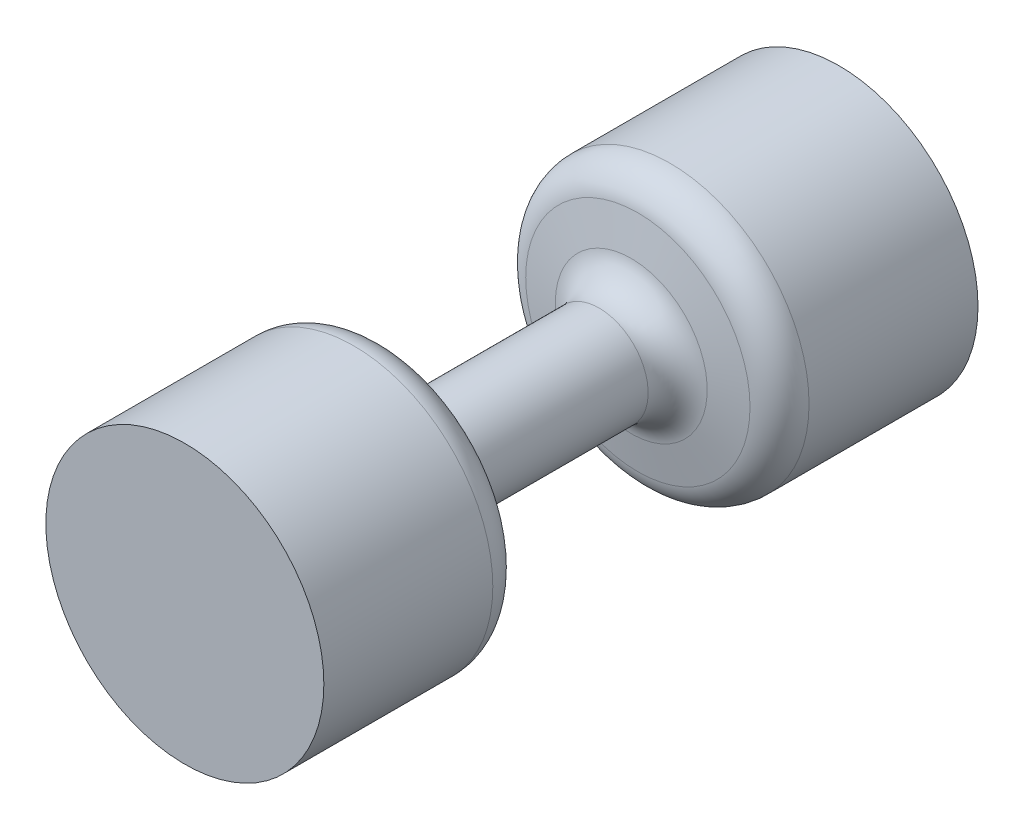
ISO-10303-21;
HEADER;
FILE_DESCRIPTION(('STEP AP214'),'2;1');
FILE_NAME('part.step','',(''),(''),'','','');
FILE_SCHEMA(('AUTOMOTIVE_DESIGN { 1 0 10303 214 1 1 1 1 }'));
ENDSEC;
DATA;
#1=APPLICATION_CONTEXT('core data for automotive mechanical design processes');
#2=APPLICATION_PROTOCOL_DEFINITION('international standard','automotive_design',2000,#1);
#3=PRODUCT_CONTEXT('',#1,'mechanical');
#4=PRODUCT('Part','Part','',(#3));
#5=PRODUCT_RELATED_PRODUCT_CATEGORY('part','',(#4));
#6=PRODUCT_DEFINITION_FORMATION('','',#4);
#7=PRODUCT_DEFINITION_CONTEXT('part definition',#1,'design');
#8=PRODUCT_DEFINITION('design','',#6,#7);
#9=PRODUCT_DEFINITION_SHAPE('','',#8);
#10=(LENGTH_UNIT() NAMED_UNIT(*) SI_UNIT(.MILLI.,.METRE.));
#11=(NAMED_UNIT(*) PLANE_ANGLE_UNIT() SI_UNIT($,.RADIAN.));
#12=(NAMED_UNIT(*) SI_UNIT($,.STERADIAN.) SOLID_ANGLE_UNIT());
#13=UNCERTAINTY_MEASURE_WITH_UNIT(LENGTH_MEASURE(1.E-05),#10,'distance_accuracy_value','');
#14=(GEOMETRIC_REPRESENTATION_CONTEXT(3) GLOBAL_UNCERTAINTY_ASSIGNED_CONTEXT((#13)) GLOBAL_UNIT_ASSIGNED_CONTEXT((#10,
#11,#12)) REPRESENTATION_CONTEXT('',''));
#15=CARTESIAN_POINT('',(0.,0.,0.));
#16=DIRECTION('',(0.,0.,1.));
#17=DIRECTION('',(1.,0.,0.));
#18=AXIS2_PLACEMENT_3D('',#15,#16,#17);
#19=CARTESIAN_POINT('',(0.,0.,-20.));
#20=DIRECTION('',(0.,0.,1.));
#21=DIRECTION('',(1.,0.,0.));
#22=AXIS2_PLACEMENT_3D('',#19,#20,#21);
#23=CYLINDRICAL_SURFACE('',#22,8.5);
#24=CARTESIAN_POINT('',(0.,0.,9.66915270681799));
#25=DIRECTION('',(0.,0.,1.));
#26=DIRECTION('',(1.,0.,0.));
#27=AXIS2_PLACEMENT_3D('',#24,#25,#26);
#28=CIRCLE('',#27,8.5);
#29=CARTESIAN_POINT('',(8.5,0.,9.66915270681799));
#30=VERTEX_POINT('',#29);
#31=EDGE_CURVE('E10',#30,#30,#28,.T.);
#32=ORIENTED_EDGE('',*,*,#31,.T.);
#33=EDGE_LOOP('',(#32));
#34=FACE_BOUND('',#33,.T.);
#35=CARTESIAN_POINT('',(0.,0.,20.));
#36=DIRECTION('',(0.,0.,1.));
#37=DIRECTION('',(1.,0.,0.));
#38=AXIS2_PLACEMENT_3D('',#35,#36,#37);
#39=CIRCLE('',#38,8.5);
#40=CARTESIAN_POINT('',(8.5,0.,20.));
#41=VERTEX_POINT('',#40);
#42=EDGE_CURVE('E109',#41,#41,#39,.T.);
#43=ORIENTED_EDGE('',*,*,#42,.F.);
#44=EDGE_LOOP('',(#43));
#45=FACE_BOUND('',#44,.T.);
#46=ADVANCED_FACE('F40',(#34,#45),#23,.T.);
#47=CARTESIAN_POINT('',(0.,0.,20.));
#48=DIRECTION('',(0.,0.,1.));
#49=DIRECTION('',(1.,0.,0.));
#50=AXIS2_PLACEMENT_3D('',#47,#48,#49);
#51=PLANE('',#50);
#52=ORIENTED_EDGE('',*,*,#42,.T.);
#53=EDGE_LOOP('',(#52));
#54=FACE_BOUND('',#53,.T.);
#55=ADVANCED_FACE('F114',(#54),#51,.T.);
#56=CARTESIAN_POINT('',(0.,0.,8.));
#57=DIRECTION('',(0.,0.,1.));
#58=DIRECTION('',(1.,0.,0.));
#59=AXIS2_PLACEMENT_3D('',#56,#57,#58);
#60=CONICAL_SURFACE('',#59,8.5,1.39094282700242);
#61=CARTESIAN_POINT('',(0.,0.,7.70141288661818));
#62=DIRECTION('',(0.,0.,1.));
#63=DIRECTION('',(1.,0.,0.));
#64=AXIS2_PLACEMENT_3D('',#61,#62,#63);
#65=CIRCLE('',#64,6.85777087639997);
#66=CARTESIAN_POINT('',(6.85777087639997,0.,7.70141288661818));
#67=VERTEX_POINT('',#66);
#68=EDGE_CURVE('E49',#67,#67,#65,.F.);
#69=ORIENTED_EDGE('',*,*,#68,.T.);
#70=EDGE_LOOP('',(#69));
#71=FACE_BOUND('',#70,.T.);
#72=CARTESIAN_POINT('',(0.,0.,7.29858711338183));
#73=DIRECTION('',(0.,0.,1.));
#74=DIRECTION('',(1.,0.,0.));
#75=AXIS2_PLACEMENT_3D('',#72,#73,#74);
#76=CIRCLE('',#75,4.64222912360003);
#77=CARTESIAN_POINT('',(4.64222912360003,0.,7.29858711338183));
#78=VERTEX_POINT('',#77);
#79=EDGE_CURVE('E54',#78,#78,#76,.T.);
#80=ORIENTED_EDGE('',*,*,#79,.T.);
#81=EDGE_LOOP('',(#80));
#82=FACE_BOUND('',#81,.T.);
#83=ADVANCED_FACE('F122',(#71,#82),#60,.T.);
#84=CARTESIAN_POINT('',(0.,0.,-7.));
#85=DIRECTION('',(0.,0.,-1.));
#86=DIRECTION('',(-1.,0.,0.));
#87=AXIS2_PLACEMENT_3D('',#84,#85,#86);
#88=CONICAL_SURFACE('',#87,3.,1.39094282700242);
#89=CARTESIAN_POINT('',(0.,0.,-7.70141288661818));
#90=DIRECTION('',(0.,0.,-1.));
#91=DIRECTION('',(-1.,0.,0.));
#92=AXIS2_PLACEMENT_3D('',#89,#90,#91);
#93=CIRCLE('',#92,6.85777087639996);
#94=CARTESIAN_POINT('',(-6.85777087639996,0.,-7.70141288661818));
#95=VERTEX_POINT('',#94);
#96=EDGE_CURVE('E69',#95,#95,#93,.F.);
#97=ORIENTED_EDGE('',*,*,#96,.T.);
#98=EDGE_LOOP('',(#97));
#99=FACE_BOUND('',#98,.T.);
#100=CARTESIAN_POINT('',(0.,0.,-7.29858711338182));
#101=DIRECTION('',(0.,0.,-1.));
#102=DIRECTION('',(-1.,0.,0.));
#103=AXIS2_PLACEMENT_3D('',#100,#101,#102);
#104=CIRCLE('',#103,4.64222912360003);
#105=CARTESIAN_POINT('',(-4.64222912360003,0.,-7.29858711338182));
#106=VERTEX_POINT('',#105);
#107=EDGE_CURVE('E73',#106,#106,#104,.T.);
#108=ORIENTED_EDGE('',*,*,#107,.T.);
#109=EDGE_LOOP('',(#108));
#110=FACE_BOUND('',#109,.T.);
#111=ADVANCED_FACE('F146',(#99,#110),#88,.T.);
#112=CARTESIAN_POINT('',(0.,0.,-22.));
#113=DIRECTION('',(0.,0.,-1.));
#114=DIRECTION('',(-1.,0.,0.));
#115=AXIS2_PLACEMENT_3D('',#112,#113,#114);
#116=CYLINDRICAL_SURFACE('',#115,3.);
#117=CARTESIAN_POINT('',(0.,0.,-5.33084729318201));
#118=DIRECTION('',(0.,0.,-1.));
#119=DIRECTION('',(-1.,0.,0.));
#120=AXIS2_PLACEMENT_3D('',#117,#118,#119);
#121=CIRCLE('',#120,3.);
#122=CARTESIAN_POINT('',(-3.,0.,-5.33084729318201));
#123=VERTEX_POINT('',#122);
#124=EDGE_CURVE('E59',#123,#123,#121,.F.);
#125=ORIENTED_EDGE('',*,*,#124,.T.);
#126=EDGE_LOOP('',(#125));
#127=FACE_BOUND('',#126,.T.);
#128=CARTESIAN_POINT('',(0.,0.,5.33084729318201));
#129=DIRECTION('',(0.,0.,-1.));
#130=DIRECTION('',(-1.,0.,0.));
#131=AXIS2_PLACEMENT_3D('',#128,#129,#130);
#132=CIRCLE('',#131,3.);
#133=CARTESIAN_POINT('',(-3.,0.,5.33084729318201));
#134=VERTEX_POINT('',#133);
#135=EDGE_CURVE('E65',#134,#134,#132,.T.);
#136=ORIENTED_EDGE('',*,*,#135,.T.);
#137=EDGE_LOOP('',(#136));
#138=FACE_BOUND('',#137,.T.);
#139=ADVANCED_FACE('F137',(#127,#138),#116,.T.);
#140=CARTESIAN_POINT('',(0.,0.,-20.));
#141=DIRECTION('',(0.,0.,1.));
#142=DIRECTION('',(1.,0.,0.));
#143=AXIS2_PLACEMENT_3D('',#140,#141,#142);
#144=PLANE('',#143);
#145=CARTESIAN_POINT('',(0.,0.,-20.));
#146=DIRECTION('',(0.,0.,1.));
#147=DIRECTION('',(1.,0.,0.));
#148=AXIS2_PLACEMENT_3D('',#145,#146,#147);
#149=CIRCLE('',#148,8.5);
#150=CARTESIAN_POINT('',(8.5,0.,-20.));
#151=VERTEX_POINT('',#150);
#152=EDGE_CURVE('E87',#151,#151,#149,.T.);
#153=ORIENTED_EDGE('',*,*,#152,.F.);
#154=EDGE_LOOP('',(#153));
#155=FACE_BOUND('',#154,.T.);
#156=ADVANCED_FACE('F128',(#155),#144,.F.);
#157=CARTESIAN_POINT('',(0.,0.,-9.66915270681799));
#158=DIRECTION('',(0.,0.,1.));
#159=DIRECTION('',(1.,0.,0.));
#160=AXIS2_PLACEMENT_3D('',#157,#158,#159);
#161=CIRCLE('',#160,8.5);
#162=CARTESIAN_POINT('',(8.5,0.,-9.66915270681799));
#163=VERTEX_POINT('',#162);
#164=EDGE_CURVE('E77',#163,#163,#161,.F.);
#165=ORIENTED_EDGE('',*,*,#164,.T.);
#166=EDGE_LOOP('',(#165));
#167=FACE_BOUND('',#166,.T.);
#168=ORIENTED_EDGE('',*,*,#152,.T.);
#169=EDGE_LOOP('',(#168));
#170=FACE_BOUND('',#169,.T.);
#171=ADVANCED_FACE('F118',(#167,#170),#23,.T.);
#172=CARTESIAN_POINT('',(0.,0.,-9.66915270681799));
#173=DIRECTION('',(0.,0.,1.));
#174=DIRECTION('',(1.,0.,0.));
#175=AXIS2_PLACEMENT_3D('',#172,#173,#174);
#176=TOROIDAL_SURFACE('',#175,6.5,2.);
#177=ORIENTED_EDGE('',*,*,#96,.F.);
#178=EDGE_LOOP('',(#177));
#179=FACE_BOUND('',#178,.T.);
#180=ORIENTED_EDGE('',*,*,#164,.F.);
#181=EDGE_LOOP('',(#180));
#182=FACE_BOUND('',#181,.T.);
#183=ADVANCED_FACE('F127',(#179,#182),#176,.T.);
#184=CARTESIAN_POINT('',(0.,0.,-5.33084729318201));
#185=DIRECTION('',(0.,0.,-1.));
#186=DIRECTION('',(-1.,0.,0.));
#187=AXIS2_PLACEMENT_3D('',#184,#185,#186);
#188=TOROIDAL_SURFACE('',#187,5.,2.);
#189=ORIENTED_EDGE('',*,*,#124,.F.);
#190=EDGE_LOOP('',(#189));
#191=FACE_BOUND('',#190,.T.);
#192=ORIENTED_EDGE('',*,*,#107,.F.);
#193=EDGE_LOOP('',(#192));
#194=FACE_BOUND('',#193,.T.);
#195=ADVANCED_FACE('F134',(#191,#194),#188,.F.);
#196=CARTESIAN_POINT('',(0.,0.,9.66915270681799));
#197=DIRECTION('',(0.,0.,1.));
#198=DIRECTION('',(1.,0.,0.));
#199=AXIS2_PLACEMENT_3D('',#196,#197,#198);
#200=TOROIDAL_SURFACE('',#199,6.5,2.);
#201=ORIENTED_EDGE('',*,*,#31,.F.);
#202=EDGE_LOOP('',(#201));
#203=FACE_BOUND('',#202,.T.);
#204=ORIENTED_EDGE('',*,*,#68,.F.);
#205=EDGE_LOOP('',(#204));
#206=FACE_BOUND('',#205,.T.);
#207=ADVANCED_FACE('F161',(#203,#206),#200,.T.);
#208=CARTESIAN_POINT('',(0.,0.,5.33084729318201));
#209=DIRECTION('',(0.,0.,-1.));
#210=DIRECTION('',(-1.,0.,0.));
#211=AXIS2_PLACEMENT_3D('',#208,#209,#210);
#212=TOROIDAL_SURFACE('',#211,5.,2.);
#213=ORIENTED_EDGE('',*,*,#79,.F.);
#214=EDGE_LOOP('',(#213));
#215=FACE_BOUND('',#214,.T.);
#216=ORIENTED_EDGE('',*,*,#135,.F.);
#217=EDGE_LOOP('',(#216));
#218=FACE_BOUND('',#217,.T.);
#219=ADVANCED_FACE('F42',(#215,#218),#212,.F.);
#220=CLOSED_SHELL('',(#46,#55,#83,#111,#139,#156,#171,#183,#195,#207,#219));
#221=CARTESIAN_POINT('',(0.,0.,-20.));
#222=DIRECTION('',(0.,0.,1.));
#223=DIRECTION('',(1.,0.,0.));
#224=AXIS2_PLACEMENT_3D('',#221,#222,#223);
#225=CYLINDRICAL_SURFACE('',#224,6.5);
#226=CARTESIAN_POINT('',(0.,0.,9.66915270681799));
#227=DIRECTION('',(0.,0.,1.));
#228=DIRECTION('',(1.,0.,0.));
#229=AXIS2_PLACEMENT_3D('',#226,#227,#228);
#230=CIRCLE('',#229,6.5);
#231=CARTESIAN_POINT('',(6.5,0.,9.66915270681799));
#232=VERTEX_POINT('',#231);
#233=EDGE_CURVE('E86',#232,#232,#230,.F.);
#234=ORIENTED_EDGE('',*,*,#233,.T.);
#235=EDGE_LOOP('',(#234));
#236=FACE_BOUND('',#235,.T.);
#237=CARTESIAN_POINT('',(0.,0.,18.));
#238=DIRECTION('',(0.,0.,1.));
#239=DIRECTION('',(1.,0.,0.));
#240=AXIS2_PLACEMENT_3D('',#237,#238,#239);
#241=CIRCLE('',#240,6.5);
#242=CARTESIAN_POINT('',(6.5,0.,18.));
#243=VERTEX_POINT('',#242);
#244=EDGE_CURVE('E82',#243,#243,#241,.T.);
#245=ORIENTED_EDGE('',*,*,#244,.T.);
#246=EDGE_LOOP('',(#245));
#247=FACE_BOUND('',#246,.T.);
#248=ADVANCED_FACE('F190',(#236,#247),#225,.F.);
#249=CARTESIAN_POINT('',(0.,0.,18.));
#250=DIRECTION('',(0.,0.,1.));
#251=DIRECTION('',(1.,0.,0.));
#252=AXIS2_PLACEMENT_3D('',#249,#250,#251);
#253=PLANE('',#252);
#254=ORIENTED_EDGE('',*,*,#244,.F.);
#255=EDGE_LOOP('',(#254));
#256=FACE_BOUND('',#255,.T.);
#257=ADVANCED_FACE('F187',(#256),#253,.F.);
#258=CARTESIAN_POINT('',(0.,0.,9.96773982019981));
#259=DIRECTION('',(0.,0.,1.));
#260=DIRECTION('',(1.,0.,0.));
#261=AXIS2_PLACEMENT_3D('',#258,#259,#260);
#262=CONICAL_SURFACE('',#261,8.14222912360003,1.39094282700242);
#263=CARTESIAN_POINT('',(0.,0.,8.66915270681799));
#264=DIRECTION('',(0.,0.,1.));
#265=DIRECTION('',(1.,0.,0.));
#266=AXIS2_PLACEMENT_3D('',#263,#264,#265);
#267=CIRCLE('',#266,1.);
#268=CARTESIAN_POINT('',(0.999999999999996,0.,8.66915270681799));
#269=VERTEX_POINT('',#268);
#270=EDGE_CURVE('E95',#269,#269,#267,.F.);
#271=CARTESIAN_POINT('',(0.999999999999996,0.,8.66915270681799));
#272=CARTESIAN_POINT('',(1.05729166666666,0.,8.67956937348466));
#273=CARTESIAN_POINT('',(1.11458333333333,0.,8.68998604015132));
#274=CARTESIAN_POINT('',(1.22916666666666,0.,8.71081937348466));
#275=CARTESIAN_POINT('',(1.28645833333333,0.,8.72123604015132));
#276=CARTESIAN_POINT('',(1.40104166666666,0.,8.74206937348466));
#277=CARTESIAN_POINT('',(1.45833333333333,0.,8.75248604015132));
#278=CARTESIAN_POINT('',(1.57291666666666,0.,8.77331937348466));
#279=CARTESIAN_POINT('',(1.63020833333333,0.,8.78373604015132));
#280=CARTESIAN_POINT('',(1.74479166666666,0.,8.80456937348466));
#281=CARTESIAN_POINT('',(1.80208333333333,0.,8.81498604015132));
#282=CARTESIAN_POINT('',(1.91666666666666,0.,8.83581937348466));
#283=CARTESIAN_POINT('',(1.97395833333333,0.,8.84623604015132));
#284=CARTESIAN_POINT('',(2.08854166666666,0.,8.86706937348466));
#285=CARTESIAN_POINT('',(2.14583333333333,0.,8.87748604015132));
#286=CARTESIAN_POINT('',(2.26041666666666,0.,8.89831937348466));
#287=CARTESIAN_POINT('',(2.31770833333333,0.,8.90873604015132));
#288=CARTESIAN_POINT('',(2.43229166666666,0.,8.92956937348466));
#289=CARTESIAN_POINT('',(2.48958333333333,0.,8.93998604015132));
#290=CARTESIAN_POINT('',(2.60416666666666,0.,8.96081937348466));
#291=CARTESIAN_POINT('',(2.66145833333333,0.,8.97123604015132));
#292=CARTESIAN_POINT('',(2.77604166666666,0.,8.99206937348466));
#293=CARTESIAN_POINT('',(2.83333333333333,0.,9.00248604015132));
#294=CARTESIAN_POINT('',(2.94791666666666,0.,9.02331937348466));
#295=CARTESIAN_POINT('',(3.00520833333333,0.,9.03373604015132));
#296=CARTESIAN_POINT('',(3.11979166666666,0.,9.05456937348466));
#297=CARTESIAN_POINT('',(3.17708333333333,0.,9.06498604015132));
#298=CARTESIAN_POINT('',(3.29166666666666,0.,9.08581937348466));
#299=CARTESIAN_POINT('',(3.34895833333333,0.,9.09623604015132));
#300=CARTESIAN_POINT('',(3.46354166666666,0.,9.11706937348466));
#301=CARTESIAN_POINT('',(3.52083333333333,0.,9.12748604015132));
#302=CARTESIAN_POINT('',(3.63541666666666,0.,9.14831937348466));
#303=CARTESIAN_POINT('',(3.69270833333333,0.,9.15873604015132));
#304=CARTESIAN_POINT('',(3.80729166666666,0.,9.17956937348466));
#305=CARTESIAN_POINT('',(3.86458333333333,0.,9.18998604015132));
#306=CARTESIAN_POINT('',(3.97916666666666,0.,9.21081937348466));
#307=CARTESIAN_POINT('',(4.03645833333333,0.,9.22123604015132));
#308=CARTESIAN_POINT('',(4.15104166666666,0.,9.24206937348466));
#309=CARTESIAN_POINT('',(4.20833333333333,0.,9.25248604015132));
#310=CARTESIAN_POINT('',(4.32291666666666,0.,9.27331937348466));
#311=CARTESIAN_POINT('',(4.38020833333333,0.,9.28373604015132));
#312=CARTESIAN_POINT('',(4.49479166666666,0.,9.30456937348466));
#313=CARTESIAN_POINT('',(4.55208333333333,0.,9.31498604015132));
#314=CARTESIAN_POINT('',(4.66666666666666,0.,9.33581937348466));
#315=CARTESIAN_POINT('',(4.72395833333333,0.,9.34623604015132));
#316=CARTESIAN_POINT('',(4.83854166666666,0.,9.36706937348466));
#317=CARTESIAN_POINT('',(4.89583333333333,0.,9.37748604015132));
#318=CARTESIAN_POINT('',(5.01041666666666,0.,9.39831937348466));
#319=CARTESIAN_POINT('',(5.06770833333333,0.,9.40873604015132));
#320=CARTESIAN_POINT('',(5.18229166666666,0.,9.42956937348466));
#321=CARTESIAN_POINT('',(5.23958333333333,0.,9.43998604015132));
#322=CARTESIAN_POINT('',(5.35416666666666,0.,9.46081937348466));
#323=CARTESIAN_POINT('',(5.41145833333333,0.,9.47123604015132));
#324=CARTESIAN_POINT('',(5.52604166666666,0.,9.49206937348466));
#325=CARTESIAN_POINT('',(5.58333333333333,0.,9.50248604015132));
#326=CARTESIAN_POINT('',(5.69791666666666,0.,9.52331937348466));
#327=CARTESIAN_POINT('',(5.75520833333333,0.,9.53373604015132));
#328=CARTESIAN_POINT('',(5.86979166666666,0.,9.55456937348466));
#329=CARTESIAN_POINT('',(5.92708333333333,0.,9.56498604015132));
#330=CARTESIAN_POINT('',(6.04166666666666,0.,9.58581937348466));
#331=CARTESIAN_POINT('',(6.09895833333333,0.,9.59623604015132));
#332=CARTESIAN_POINT('',(6.21354166666666,0.,9.61706937348466));
#333=CARTESIAN_POINT('',(6.27083333333333,0.,9.62748604015132));
#334=CARTESIAN_POINT('',(6.38541666666666,0.,9.64831937348466));
#335=CARTESIAN_POINT('',(6.44270833333333,0.,9.65873604015132));
#336=CARTESIAN_POINT('',(6.5,0.,9.66915270681799));
#337=B_SPLINE_CURVE_WITH_KNOTS('',3,(#271,#272,#273,#274,#275,#276,#277,#278,#279,#280,#281,
#282,#283,#284,#285,#286,#287,#288,#289,#290,#291,#292,#293,#294,#295,#296,#297,#298,#299,#300,
#301,#302,#303,#304,#305,#306,#307,#308,#309,#310,#311,#312,#313,#314,#315,#316,#317,#318,#319,
#320,#321,#322,#323,#324,#325,#326,#327,#328,#329,#330,#331,#332,#333,#334,#335,#336),
.UNSPECIFIED.,.F.,.F.,(4,2,2,2,2,2,2,2,2,2,2,2,2,2,2,2,2,2,2,2,2,2,2,2,2,2,2,2,2,2,2,2,4),(0.,
0.174692810742171,0.349385621484342,0.524078432226513,0.698771242968684,0.873464053710855,
1.04815686445303,1.2228496751952,1.39754248593737,1.57223529667954,1.74692810742171,
1.92162091816388,2.09631372890605,2.27100653964822,2.4456993503904,2.62039216113257,
2.79508497187474,2.96977778261691,3.14447059335908,3.31916340410125,3.49385621484342,
3.66854902558559,3.84324183632776,4.01793464706993,4.1926274578121,4.36732026855428,
4.54201307929645,4.71670589003862,4.89139870078079,5.06609151152296,5.24078432226513,
5.4154771330073,5.59016994374947),.UNSPECIFIED.);
#338=EDGE_CURVE('BSEAM183',#269,#232,#337,.T.);
#339=ORIENTED_EDGE('',*,*,#270,.T.);
#340=ORIENTED_EDGE('',*,*,#233,.F.);
#341=ORIENTED_EDGE('',*,*,#338,.T.);
#342=ORIENTED_EDGE('',*,*,#338,.F.);
#343=EDGE_LOOP('',(#339,#341,#340,#342));
#344=FACE_BOUND('',#343,.T.);
#345=ADVANCED_FACE('F183',(#344),#262,.F.);
#346=CARTESIAN_POINT('',(0.,0.,-8.96773982019982));
#347=DIRECTION('',(0.,0.,-1.));
#348=DIRECTION('',(-1.,0.,0.));
#349=AXIS2_PLACEMENT_3D('',#346,#347,#348);
#350=CONICAL_SURFACE('',#349,2.64222912360004,1.39094282700242);
#351=CARTESIAN_POINT('',(0.,0.,-9.66915270681799));
#352=DIRECTION('',(0.,0.,-1.));
#353=DIRECTION('',(-1.,0.,0.));
#354=AXIS2_PLACEMENT_3D('',#351,#352,#353);
#355=CIRCLE('',#354,6.5);
#356=CARTESIAN_POINT('',(-6.5,0.,-9.66915270681799));
#357=VERTEX_POINT('',#356);
#358=EDGE_CURVE('E99',#357,#357,#355,.T.);
#359=CARTESIAN_POINT('',(0.,0.,-8.66915270681799));
#360=DIRECTION('',(0.,0.,-1.));
#361=DIRECTION('',(-1.,0.,0.));
#362=AXIS2_PLACEMENT_3D('',#359,#360,#361);
#363=CIRCLE('',#362,1.);
#364=CARTESIAN_POINT('',(-0.999999999999993,0.,-8.66915270681799));
#365=VERTEX_POINT('',#364);
#366=EDGE_CURVE('E91',#365,#365,#363,.T.);
#367=CARTESIAN_POINT('',(-6.5,0.,-9.66915270681799));
#368=CARTESIAN_POINT('',(-6.44270833333333,0.,-9.65873604015132));
#369=CARTESIAN_POINT('',(-6.38541666666666,0.,-9.64831937348466));
#370=CARTESIAN_POINT('',(-6.27083333333333,0.,-9.62748604015132));
#371=CARTESIAN_POINT('',(-6.21354166666666,0.,-9.61706937348466));
#372=CARTESIAN_POINT('',(-6.09895833333333,0.,-9.59623604015132));
#373=CARTESIAN_POINT('',(-6.04166666666666,0.,-9.58581937348466));
#374=CARTESIAN_POINT('',(-5.92708333333333,0.,-9.56498604015132));
#375=CARTESIAN_POINT('',(-5.86979166666666,0.,-9.55456937348466));
#376=CARTESIAN_POINT('',(-5.75520833333333,0.,-9.53373604015132));
#377=CARTESIAN_POINT('',(-5.69791666666666,0.,-9.52331937348466));
#378=CARTESIAN_POINT('',(-5.58333333333333,0.,-9.50248604015132));
#379=CARTESIAN_POINT('',(-5.52604166666666,0.,-9.49206937348466));
#380=CARTESIAN_POINT('',(-5.41145833333333,0.,-9.47123604015132));
#381=CARTESIAN_POINT('',(-5.35416666666666,0.,-9.46081937348466));
#382=CARTESIAN_POINT('',(-5.23958333333333,0.,-9.43998604015132));
#383=CARTESIAN_POINT('',(-5.18229166666666,0.,-9.42956937348466));
#384=CARTESIAN_POINT('',(-5.06770833333333,0.,-9.40873604015132));
#385=CARTESIAN_POINT('',(-5.01041666666666,0.,-9.39831937348466));
#386=CARTESIAN_POINT('',(-4.89583333333333,0.,-9.37748604015132));
#387=CARTESIAN_POINT('',(-4.83854166666666,0.,-9.36706937348466));
#388=CARTESIAN_POINT('',(-4.72395833333333,0.,-9.34623604015132));
#389=CARTESIAN_POINT('',(-4.66666666666666,0.,-9.33581937348466));
#390=CARTESIAN_POINT('',(-4.55208333333333,0.,-9.31498604015132));
#391=CARTESIAN_POINT('',(-4.49479166666666,0.,-9.30456937348466));
#392=CARTESIAN_POINT('',(-4.38020833333333,0.,-9.28373604015132));
#393=CARTESIAN_POINT('',(-4.32291666666666,0.,-9.27331937348466));
#394=CARTESIAN_POINT('',(-4.20833333333333,0.,-9.25248604015132));
#395=CARTESIAN_POINT('',(-4.15104166666666,0.,-9.24206937348466));
#396=CARTESIAN_POINT('',(-4.03645833333333,0.,-9.22123604015132));
#397=CARTESIAN_POINT('',(-3.97916666666666,0.,-9.21081937348466));
#398=CARTESIAN_POINT('',(-3.86458333333333,0.,-9.18998604015132));
#399=CARTESIAN_POINT('',(-3.80729166666666,0.,-9.17956937348466));
#400=CARTESIAN_POINT('',(-3.69270833333333,0.,-9.15873604015132));
#401=CARTESIAN_POINT('',(-3.63541666666666,0.,-9.14831937348466));
#402=CARTESIAN_POINT('',(-3.52083333333333,0.,-9.12748604015133));
#403=CARTESIAN_POINT('',(-3.46354166666666,0.,-9.11706937348466));
#404=CARTESIAN_POINT('',(-3.34895833333333,0.,-9.09623604015132));
#405=CARTESIAN_POINT('',(-3.29166666666666,0.,-9.08581937348466));
#406=CARTESIAN_POINT('',(-3.17708333333333,0.,-9.06498604015132));
#407=CARTESIAN_POINT('',(-3.11979166666666,0.,-9.05456937348466));
#408=CARTESIAN_POINT('',(-3.00520833333333,0.,-9.03373604015132));
#409=CARTESIAN_POINT('',(-2.94791666666666,0.,-9.02331937348466));
#410=CARTESIAN_POINT('',(-2.83333333333333,0.,-9.00248604015132));
#411=CARTESIAN_POINT('',(-2.77604166666666,0.,-8.99206937348466));
#412=CARTESIAN_POINT('',(-2.66145833333333,0.,-8.97123604015132));
#413=CARTESIAN_POINT('',(-2.60416666666666,0.,-8.96081937348466));
#414=CARTESIAN_POINT('',(-2.48958333333333,0.,-8.93998604015132));
#415=CARTESIAN_POINT('',(-2.43229166666666,0.,-8.92956937348466));
#416=CARTESIAN_POINT('',(-2.31770833333333,0.,-8.90873604015132));
#417=CARTESIAN_POINT('',(-2.26041666666666,0.,-8.89831937348466));
#418=CARTESIAN_POINT('',(-2.14583333333333,0.,-8.87748604015132));
#419=CARTESIAN_POINT('',(-2.08854166666666,0.,-8.86706937348466));
#420=CARTESIAN_POINT('',(-1.97395833333333,0.,-8.84623604015132));
#421=CARTESIAN_POINT('',(-1.91666666666666,0.,-8.83581937348466));
#422=CARTESIAN_POINT('',(-1.80208333333333,0.,-8.81498604015132));
#423=CARTESIAN_POINT('',(-1.74479166666666,0.,-8.80456937348466));
#424=CARTESIAN_POINT('',(-1.63020833333333,0.,-8.78373604015132));
#425=CARTESIAN_POINT('',(-1.57291666666666,0.,-8.77331937348466));
#426=CARTESIAN_POINT('',(-1.45833333333333,0.,-8.75248604015132));
#427=CARTESIAN_POINT('',(-1.40104166666666,0.,-8.74206937348466));
#428=CARTESIAN_POINT('',(-1.28645833333333,0.,-8.72123604015132));
#429=CARTESIAN_POINT('',(-1.22916666666666,0.,-8.71081937348466));
#430=CARTESIAN_POINT('',(-1.11458333333333,0.,-8.68998604015132));
#431=CARTESIAN_POINT('',(-1.05729166666666,0.,-8.67956937348466));
#432=CARTESIAN_POINT('',(-0.999999999999993,0.,-8.66915270681799));
#433=B_SPLINE_CURVE_WITH_KNOTS('',3,(#367,#368,#369,#370,#371,#372,#373,#374,#375,#376,#377,
#378,#379,#380,#381,#382,#383,#384,#385,#386,#387,#388,#389,#390,#391,#392,#393,#394,#395,#396,
#397,#398,#399,#400,#401,#402,#403,#404,#405,#406,#407,#408,#409,#410,#411,#412,#413,#414,#415,
#416,#417,#418,#419,#420,#421,#422,#423,#424,#425,#426,#427,#428,#429,#430,#431,#432),
.UNSPECIFIED.,.F.,.F.,(4,2,2,2,2,2,2,2,2,2,2,2,2,2,2,2,2,2,2,2,2,2,2,2,2,2,2,2,2,2,2,2,4),(0.,
0.174692810742171,0.349385621484342,0.524078432226514,0.698771242968685,0.873464053710856,
1.04815686445303,1.2228496751952,1.39754248593737,1.57223529667954,1.74692810742171,
1.92162091816388,2.09631372890605,2.27100653964823,2.4456993503904,2.62039216113257,
2.79508497187474,2.96977778261691,3.14447059335908,3.31916340410125,3.49385621484342,
3.66854902558559,3.84324183632776,4.01793464706993,4.19262745781211,4.36732026855428,
4.54201307929645,4.71670589003862,4.89139870078079,5.06609151152296,5.24078432226513,
5.4154771330073,5.59016994374947),.UNSPECIFIED.);
#434=EDGE_CURVE('BSEAM179',#357,#365,#433,.T.);
#435=ORIENTED_EDGE('',*,*,#358,.T.);
#436=ORIENTED_EDGE('',*,*,#366,.F.);
#437=ORIENTED_EDGE('',*,*,#434,.T.);
#438=ORIENTED_EDGE('',*,*,#434,.F.);
#439=EDGE_LOOP('',(#435,#437,#436,#438));
#440=FACE_BOUND('',#439,.T.);
#441=ADVANCED_FACE('F179',(#440),#350,.F.);
#442=CARTESIAN_POINT('',(0.,0.,-22.));
#443=DIRECTION('',(0.,0.,-1.));
#444=DIRECTION('',(-1.,0.,0.));
#445=AXIS2_PLACEMENT_3D('',#442,#443,#444);
#446=CYLINDRICAL_SURFACE('',#445,1.);
#447=ORIENTED_EDGE('',*,*,#366,.T.);
#448=EDGE_LOOP('',(#447));
#449=FACE_BOUND('',#448,.T.);
#450=ORIENTED_EDGE('',*,*,#270,.F.);
#451=EDGE_LOOP('',(#450));
#452=FACE_BOUND('',#451,.T.);
#453=ADVANCED_FACE('F174',(#449,#452),#446,.F.);
#454=CARTESIAN_POINT('',(0.,0.,-18.));
#455=DIRECTION('',(0.,0.,1.));
#456=DIRECTION('',(1.,0.,0.));
#457=AXIS2_PLACEMENT_3D('',#454,#455,#456);
#458=PLANE('',#457);
#459=CARTESIAN_POINT('',(0.,0.,-18.));
#460=DIRECTION('',(0.,0.,1.));
#461=DIRECTION('',(1.,0.,0.));
#462=AXIS2_PLACEMENT_3D('',#459,#460,#461);
#463=CIRCLE('',#462,6.5);
#464=CARTESIAN_POINT('',(6.5,0.,-18.));
#465=VERTEX_POINT('',#464);
#466=EDGE_CURVE('E81',#465,#465,#463,.T.);
#467=ORIENTED_EDGE('',*,*,#466,.T.);
#468=EDGE_LOOP('',(#467));
#469=FACE_BOUND('',#468,.T.);
#470=ADVANCED_FACE('F170',(#469),#458,.T.);
#471=ORIENTED_EDGE('',*,*,#358,.F.);
#472=EDGE_LOOP('',(#471));
#473=FACE_BOUND('',#472,.T.);
#474=ORIENTED_EDGE('',*,*,#466,.F.);
#475=EDGE_LOOP('',(#474));
#476=FACE_BOUND('',#475,.T.);
#477=ADVANCED_FACE('F173',(#473,#476),#225,.F.);
#478=CLOSED_SHELL('',(#248,#257,#345,#441,#453,#470,#477));
#479=ORIENTED_CLOSED_SHELL('',*,#478,.T.);
#480=BREP_WITH_VOIDS('B2',#220,(#479));
#481=ADVANCED_BREP_SHAPE_REPRESENTATION('',(#18,#480),#14);
#482=SHAPE_DEFINITION_REPRESENTATION(#9,#481);
ENDSEC;
END-ISO-10303-21;
